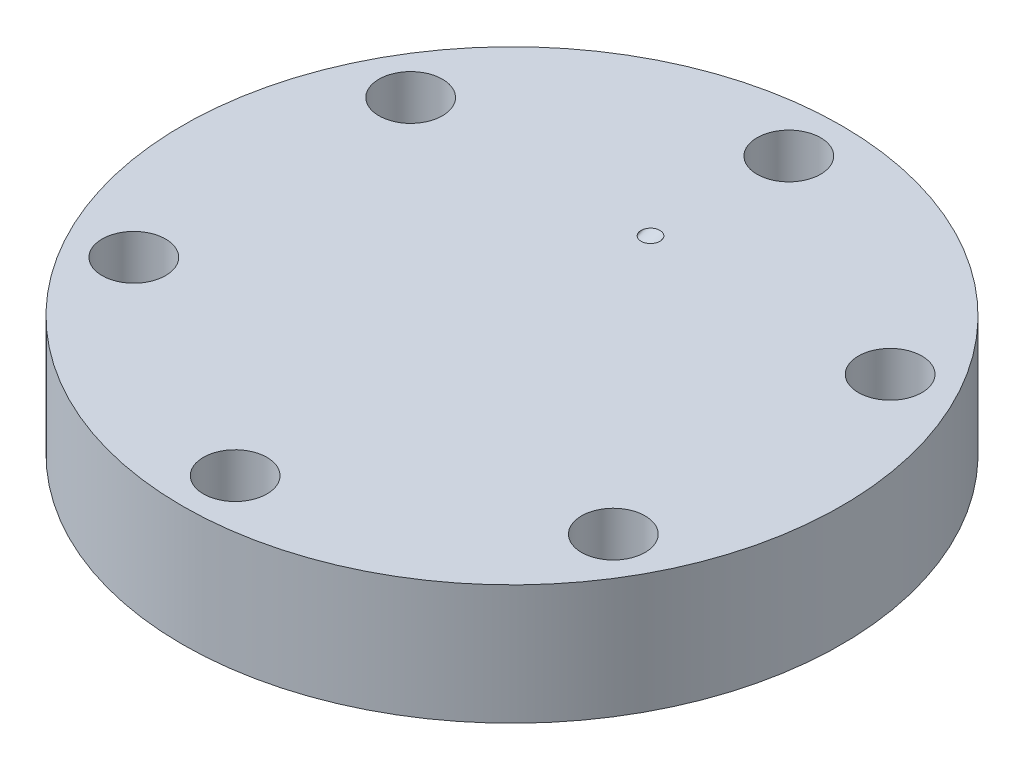
ISO-10303-21;
HEADER;
FILE_DESCRIPTION(('STEP AP214'),'2;1');
FILE_NAME('part.step','',(''),(''),'','','');
FILE_SCHEMA(('AUTOMOTIVE_DESIGN { 1 0 10303 214 1 1 1 1 }'));
ENDSEC;
DATA;
#1=APPLICATION_CONTEXT('core data for automotive mechanical design processes');
#2=APPLICATION_PROTOCOL_DEFINITION('international standard','automotive_design',2000,#1);
#3=PRODUCT_CONTEXT('',#1,'mechanical');
#4=PRODUCT('Part','Part','',(#3));
#5=PRODUCT_RELATED_PRODUCT_CATEGORY('part','',(#4));
#6=PRODUCT_DEFINITION_FORMATION('','',#4);
#7=PRODUCT_DEFINITION_CONTEXT('part definition',#1,'design');
#8=PRODUCT_DEFINITION('design','',#6,#7);
#9=PRODUCT_DEFINITION_SHAPE('','',#8);
#10=(LENGTH_UNIT() NAMED_UNIT(*) SI_UNIT(.MILLI.,.METRE.));
#11=(NAMED_UNIT(*) PLANE_ANGLE_UNIT() SI_UNIT($,.RADIAN.));
#12=(NAMED_UNIT(*) SI_UNIT($,.STERADIAN.) SOLID_ANGLE_UNIT());
#13=UNCERTAINTY_MEASURE_WITH_UNIT(LENGTH_MEASURE(1.E-05),#10,'distance_accuracy_value','');
#14=(GEOMETRIC_REPRESENTATION_CONTEXT(3) GLOBAL_UNCERTAINTY_ASSIGNED_CONTEXT((#13)) GLOBAL_UNIT_ASSIGNED_CONTEXT((#10,
#11,#12)) REPRESENTATION_CONTEXT('',''));
#15=CARTESIAN_POINT('',(0.,0.,0.));
#16=DIRECTION('',(0.,0.,1.));
#17=DIRECTION('',(1.,0.,0.));
#18=AXIS2_PLACEMENT_3D('',#15,#16,#17);
#19=CARTESIAN_POINT('',(0.,12.7,0.));
#20=DIRECTION('',(0.,1.,0.));
#21=DIRECTION('',(0.,0.,1.));
#22=AXIS2_PLACEMENT_3D('',#19,#20,#21);
#23=PLANE('',#22);
#24=CARTESIAN_POINT('',(0.,12.7,-14.6812));
#25=DIRECTION('',(0.,1.,0.));
#26=DIRECTION('',(0.,0.,1.));
#27=AXIS2_PLACEMENT_3D('',#24,#25,#26);
#28=CIRCLE('',#27,1.);
#29=CARTESIAN_POINT('',(0.0878511965507435,12.7,-13.6850663908568));
#30=VERTEX_POINT('',#29);
#31=EDGE_CURVE('E126',#30,#30,#28,.T.);
#32=ORIENTED_EDGE('',*,*,#31,.F.);
#33=EDGE_LOOP('',(#32));
#34=FACE_BOUND('',#33,.T.);
#35=CARTESIAN_POINT('',(25.4065872708242,12.7,14.6684999999998));
#36=DIRECTION('',(0.,1.,0.));
#37=DIRECTION('',(-0.866025403784443,0.,-0.499999999999992));
#38=AXIS2_PLACEMENT_3D('',#35,#36,#37);
#39=CIRCLE('',#38,3.3655);
#40=CARTESIAN_POINT('',(22.4919787743877,12.7,12.9857499999998));
#41=VERTEX_POINT('',#40);
#42=EDGE_CURVE('E146',#41,#41,#39,.T.);
#43=ORIENTED_EDGE('',*,*,#42,.F.);
#44=EDGE_LOOP('',(#43));
#45=FACE_BOUND('',#44,.T.);
#46=CARTESIAN_POINT('',(-25.406587270824,12.7,14.6685000000001));
#47=DIRECTION('',(0.,1.,0.));
#48=DIRECTION('',(0.866025403784436,0.,-0.500000000000004));
#49=AXIS2_PLACEMENT_3D('',#46,#47,#48);
#50=CIRCLE('',#49,3.3655);
#51=CARTESIAN_POINT('',(-22.4919787743875,12.7,12.9857500000001));
#52=VERTEX_POINT('',#51);
#53=EDGE_CURVE('E158',#52,#52,#50,.T.);
#54=ORIENTED_EDGE('',*,*,#53,.F.);
#55=EDGE_LOOP('',(#54));
#56=FACE_BOUND('',#55,.T.);
#57=CARTESIAN_POINT('',(0.,12.7,-29.337));
#58=DIRECTION('',(0.,1.,0.));
#59=DIRECTION('',(0.,0.,1.));
#60=AXIS2_PLACEMENT_3D('',#57,#58,#59);
#61=CIRCLE('',#60,3.3655);
#62=CARTESIAN_POINT('',(0.,12.7,-25.9715));
#63=VERTEX_POINT('',#62);
#64=EDGE_CURVE('E55',#63,#63,#61,.T.);
#65=ORIENTED_EDGE('',*,*,#64,.F.);
#66=EDGE_LOOP('',(#65));
#67=FACE_BOUND('',#66,.T.);
#68=CARTESIAN_POINT('',(0.,12.7,0.));
#69=DIRECTION('',(0.,1.,0.));
#70=DIRECTION('',(0.,0.,1.));
#71=AXIS2_PLACEMENT_3D('',#68,#69,#70);
#72=CIRCLE('',#71,34.925);
#73=CARTESIAN_POINT('',(0.,12.7,34.925));
#74=VERTEX_POINT('',#73);
#75=EDGE_CURVE('E11',#74,#74,#72,.T.);
#76=ORIENTED_EDGE('',*,*,#75,.T.);
#77=EDGE_LOOP('',(#76));
#78=FACE_BOUND('',#77,.T.);
#79=CARTESIAN_POINT('',(-25.4065872708241,12.7,-14.6684999999999));
#80=DIRECTION('',(0.,1.,0.));
#81=DIRECTION('',(0.86602540378444,0.,0.499999999999998));
#82=AXIS2_PLACEMENT_3D('',#79,#80,#81);
#83=CIRCLE('',#82,3.3655);
#84=CARTESIAN_POINT('',(-22.4919787743876,12.7,-12.9857499999999));
#85=VERTEX_POINT('',#84);
#86=EDGE_CURVE('E164',#85,#85,#83,.T.);
#87=ORIENTED_EDGE('',*,*,#86,.F.);
#88=EDGE_LOOP('',(#87));
#89=FACE_BOUND('',#88,.T.);
#90=CARTESIAN_POINT('',(2.04859176075282E-13,12.7,29.337));
#91=DIRECTION('',(0.,1.,0.));
#92=DIRECTION('',(0.,0.,-1.));
#93=AXIS2_PLACEMENT_3D('',#90,#91,#92);
#94=CIRCLE('',#93,3.3655);
#95=CARTESIAN_POINT('',(1.81358015183529E-13,12.7,25.9715));
#96=VERTEX_POINT('',#95);
#97=EDGE_CURVE('E152',#96,#96,#94,.T.);
#98=ORIENTED_EDGE('',*,*,#97,.F.);
#99=EDGE_LOOP('',(#98));
#100=FACE_BOUND('',#99,.T.);
#101=CARTESIAN_POINT('',(25.4065872708239,12.7,-14.6685000000003));
#102=DIRECTION('',(0.,1.,0.));
#103=DIRECTION('',(-0.866025403784433,0.,0.50000000000001));
#104=AXIS2_PLACEMENT_3D('',#101,#102,#103);
#105=CIRCLE('',#104,3.3655);
#106=CARTESIAN_POINT('',(22.4919787743874,12.7,-12.9857500000003));
#107=VERTEX_POINT('',#106);
#108=EDGE_CURVE('E140',#107,#107,#105,.T.);
#109=ORIENTED_EDGE('',*,*,#108,.F.);
#110=EDGE_LOOP('',(#109));
#111=FACE_BOUND('',#110,.T.);
#112=ADVANCED_FACE('F40',(#34,#45,#56,#67,#78,#89,#100,#111),#23,.T.);
#113=CARTESIAN_POINT('',(0.,0.,0.));
#114=DIRECTION('',(0.,1.,0.));
#115=DIRECTION('',(0.,0.,1.));
#116=AXIS2_PLACEMENT_3D('',#113,#114,#115);
#117=PLANE('',#116);
#118=CARTESIAN_POINT('',(0.,0.,14.6812));
#119=DIRECTION('',(0.,1.,0.));
#120=DIRECTION('',(0.,0.,1.));
#121=AXIS2_PLACEMENT_3D('',#118,#119,#120);
#122=CIRCLE('',#121,1.);
#123=CARTESIAN_POINT('',(0.,0.,15.6812));
#124=VERTEX_POINT('',#123);
#125=EDGE_CURVE('E65',#124,#124,#122,.T.);
#126=ORIENTED_EDGE('',*,*,#125,.T.);
#127=EDGE_LOOP('',(#126));
#128=FACE_BOUND('',#127,.T.);
#129=CARTESIAN_POINT('',(25.4065872708242,0.,14.6684999999998));
#130=DIRECTION('',(0.,1.,0.));
#131=DIRECTION('',(-0.866025403784443,0.,-0.499999999999992));
#132=AXIS2_PLACEMENT_3D('',#129,#130,#131);
#133=CIRCLE('',#132,3.3655);
#134=CARTESIAN_POINT('',(22.4919787743877,0.,12.9857499999998));
#135=VERTEX_POINT('',#134);
#136=EDGE_CURVE('E143',#135,#135,#133,.T.);
#137=ORIENTED_EDGE('',*,*,#136,.T.);
#138=EDGE_LOOP('',(#137));
#139=FACE_BOUND('',#138,.T.);
#140=CARTESIAN_POINT('',(-25.406587270824,0.,14.6685000000001));
#141=DIRECTION('',(0.,1.,0.));
#142=DIRECTION('',(0.866025403784436,0.,-0.500000000000004));
#143=AXIS2_PLACEMENT_3D('',#140,#141,#142);
#144=CIRCLE('',#143,3.3655);
#145=CARTESIAN_POINT('',(-22.4919787743875,0.,12.9857500000001));
#146=VERTEX_POINT('',#145);
#147=EDGE_CURVE('E155',#146,#146,#144,.T.);
#148=ORIENTED_EDGE('',*,*,#147,.T.);
#149=EDGE_LOOP('',(#148));
#150=FACE_BOUND('',#149,.T.);
#151=CARTESIAN_POINT('',(0.,0.,-29.337));
#152=DIRECTION('',(0.,1.,0.));
#153=DIRECTION('',(0.,0.,1.));
#154=AXIS2_PLACEMENT_3D('',#151,#152,#153);
#155=CIRCLE('',#154,3.3655);
#156=CARTESIAN_POINT('',(0.,0.,-25.9715));
#157=VERTEX_POINT('',#156);
#158=EDGE_CURVE('E58',#157,#157,#155,.T.);
#159=ORIENTED_EDGE('',*,*,#158,.T.);
#160=EDGE_LOOP('',(#159));
#161=FACE_BOUND('',#160,.T.);
#162=CARTESIAN_POINT('',(0.,0.,0.));
#163=DIRECTION('',(0.,1.,0.));
#164=DIRECTION('',(0.,0.,1.));
#165=AXIS2_PLACEMENT_3D('',#162,#163,#164);
#166=CIRCLE('',#165,34.925);
#167=CARTESIAN_POINT('',(0.,0.,34.925));
#168=VERTEX_POINT('',#167);
#169=EDGE_CURVE('E50',#168,#168,#166,.T.);
#170=ORIENTED_EDGE('',*,*,#169,.F.);
#171=EDGE_LOOP('',(#170));
#172=FACE_BOUND('',#171,.T.);
#173=CARTESIAN_POINT('',(-25.4065872708241,0.,-14.6684999999999));
#174=DIRECTION('',(0.,1.,0.));
#175=DIRECTION('',(0.86602540378444,0.,0.499999999999998));
#176=AXIS2_PLACEMENT_3D('',#173,#174,#175);
#177=CIRCLE('',#176,3.3655);
#178=CARTESIAN_POINT('',(-22.4919787743876,0.,-12.9857499999999));
#179=VERTEX_POINT('',#178);
#180=EDGE_CURVE('E161',#179,#179,#177,.T.);
#181=ORIENTED_EDGE('',*,*,#180,.T.);
#182=EDGE_LOOP('',(#181));
#183=FACE_BOUND('',#182,.T.);
#184=CARTESIAN_POINT('',(2.04859176075282E-13,0.,29.337));
#185=DIRECTION('',(0.,1.,0.));
#186=DIRECTION('',(0.,0.,-1.));
#187=AXIS2_PLACEMENT_3D('',#184,#185,#186);
#188=CIRCLE('',#187,3.3655);
#189=CARTESIAN_POINT('',(1.81358015183529E-13,0.,25.9715));
#190=VERTEX_POINT('',#189);
#191=EDGE_CURVE('E149',#190,#190,#188,.T.);
#192=ORIENTED_EDGE('',*,*,#191,.T.);
#193=EDGE_LOOP('',(#192));
#194=FACE_BOUND('',#193,.T.);
#195=CARTESIAN_POINT('',(25.4065872708239,0.,-14.6685000000003));
#196=DIRECTION('',(0.,1.,0.));
#197=DIRECTION('',(-0.866025403784433,0.,0.50000000000001));
#198=AXIS2_PLACEMENT_3D('',#195,#196,#197);
#199=CIRCLE('',#198,3.3655);
#200=CARTESIAN_POINT('',(22.4919787743874,0.,-12.9857500000003));
#201=VERTEX_POINT('',#200);
#202=EDGE_CURVE('E134',#201,#201,#199,.T.);
#203=ORIENTED_EDGE('',*,*,#202,.T.);
#204=EDGE_LOOP('',(#203));
#205=FACE_BOUND('',#204,.T.);
#206=ADVANCED_FACE('F69',(#128,#139,#150,#161,#172,#183,#194,#205),#117,.F.);
#207=CARTESIAN_POINT('',(0.,12.7,0.));
#208=DIRECTION('',(0.,-1.,0.));
#209=DIRECTION('',(0.,0.,-1.));
#210=AXIS2_PLACEMENT_3D('',#207,#208,#209);
#211=CYLINDRICAL_SURFACE('',#210,34.925);
#212=ORIENTED_EDGE('',*,*,#75,.F.);
#213=EDGE_LOOP('',(#212));
#214=FACE_BOUND('',#213,.T.);
#215=ORIENTED_EDGE('',*,*,#169,.T.);
#216=EDGE_LOOP('',(#215));
#217=FACE_BOUND('',#216,.T.);
#218=ADVANCED_FACE('F42',(#214,#217),#211,.T.);
#219=CARTESIAN_POINT('',(0.,12.7,-29.337));
#220=DIRECTION('',(0.,-1.,0.));
#221=DIRECTION('',(0.,0.,-1.));
#222=AXIS2_PLACEMENT_3D('',#219,#220,#221);
#223=CYLINDRICAL_SURFACE('',#222,3.3655);
#224=ORIENTED_EDGE('',*,*,#64,.T.);
#225=EDGE_LOOP('',(#224));
#226=FACE_BOUND('',#225,.T.);
#227=ORIENTED_EDGE('',*,*,#158,.F.);
#228=EDGE_LOOP('',(#227));
#229=FACE_BOUND('',#228,.T.);
#230=ADVANCED_FACE('F81',(#226,#229),#223,.F.);
#231=CARTESIAN_POINT('',(-25.4065872708241,12.7,-14.6684999999999));
#232=DIRECTION('',(0.,-1.,0.));
#233=DIRECTION('',(0.,0.,-1.));
#234=AXIS2_PLACEMENT_3D('',#231,#232,#233);
#235=CYLINDRICAL_SURFACE('',#234,3.3655);
#236=ORIENTED_EDGE('',*,*,#86,.T.);
#237=EDGE_LOOP('',(#236));
#238=FACE_BOUND('',#237,.T.);
#239=ORIENTED_EDGE('',*,*,#180,.F.);
#240=EDGE_LOOP('',(#239));
#241=FACE_BOUND('',#240,.T.);
#242=ADVANCED_FACE('F84',(#238,#241),#235,.F.);
#243=CARTESIAN_POINT('',(-25.406587270824,12.7,14.6685000000001));
#244=DIRECTION('',(0.,-1.,0.));
#245=DIRECTION('',(0.,0.,-1.));
#246=AXIS2_PLACEMENT_3D('',#243,#244,#245);
#247=CYLINDRICAL_SURFACE('',#246,3.3655);
#248=ORIENTED_EDGE('',*,*,#53,.T.);
#249=EDGE_LOOP('',(#248));
#250=FACE_BOUND('',#249,.T.);
#251=ORIENTED_EDGE('',*,*,#147,.F.);
#252=EDGE_LOOP('',(#251));
#253=FACE_BOUND('',#252,.T.);
#254=ADVANCED_FACE('F88',(#250,#253),#247,.F.);
#255=CARTESIAN_POINT('',(2.04859176075282E-13,12.7,29.337));
#256=DIRECTION('',(0.,-1.,0.));
#257=DIRECTION('',(0.,0.,-1.));
#258=AXIS2_PLACEMENT_3D('',#255,#256,#257);
#259=CYLINDRICAL_SURFACE('',#258,3.3655);
#260=ORIENTED_EDGE('',*,*,#97,.T.);
#261=EDGE_LOOP('',(#260));
#262=FACE_BOUND('',#261,.T.);
#263=ORIENTED_EDGE('',*,*,#191,.F.);
#264=EDGE_LOOP('',(#263));
#265=FACE_BOUND('',#264,.T.);
#266=ADVANCED_FACE('F92',(#262,#265),#259,.F.);
#267=CARTESIAN_POINT('',(25.4065872708242,12.7,14.6684999999998));
#268=DIRECTION('',(0.,-1.,0.));
#269=DIRECTION('',(0.,0.,-1.));
#270=AXIS2_PLACEMENT_3D('',#267,#268,#269);
#271=CYLINDRICAL_SURFACE('',#270,3.3655);
#272=ORIENTED_EDGE('',*,*,#42,.T.);
#273=EDGE_LOOP('',(#272));
#274=FACE_BOUND('',#273,.T.);
#275=ORIENTED_EDGE('',*,*,#136,.F.);
#276=EDGE_LOOP('',(#275));
#277=FACE_BOUND('',#276,.T.);
#278=ADVANCED_FACE('F96',(#274,#277),#271,.F.);
#279=CARTESIAN_POINT('',(25.4065872708239,12.7,-14.6685000000003));
#280=DIRECTION('',(0.,-1.,0.));
#281=DIRECTION('',(0.,0.,-1.));
#282=AXIS2_PLACEMENT_3D('',#279,#280,#281);
#283=CYLINDRICAL_SURFACE('',#282,3.3655);
#284=ORIENTED_EDGE('',*,*,#108,.T.);
#285=EDGE_LOOP('',(#284));
#286=FACE_BOUND('',#285,.T.);
#287=ORIENTED_EDGE('',*,*,#202,.F.);
#288=EDGE_LOOP('',(#287));
#289=FACE_BOUND('',#288,.T.);
#290=ADVANCED_FACE('F100',(#286,#289),#283,.F.);
#291=CARTESIAN_POINT('',(0.0878511965507435,12.7,-13.6850663908568));
#292=CARTESIAN_POINT('',(0.,0.,15.6812));
#293=CARTESIAN_POINT('',(0.00484006245547864,12.7,-13.6777454578109));
#294=CARTESIAN_POINT('',(-0.0833333333333333,0.,15.6812));
#295=CARTESIAN_POINT('',(-0.0899523578914653,12.7,-13.6795581722554));
#296=CARTESIAN_POINT('',(-0.1776,0.,15.6710666666667));
#297=CARTESIAN_POINT('',(-0.299208165851285,12.7,-13.7210686281213));
#298=CARTESIAN_POINT('',(-0.3824,0.,15.6113333333333));
#299=CARTESIAN_POINT('',(-0.414116860879311,12.7,-13.7612625003223));
#300=CARTESIAN_POINT('',(-0.493333333333333,0.,15.5612));
#301=CARTESIAN_POINT('',(-0.640681555611307,12.7,-13.9019022891877));
#302=CARTESIAN_POINT('',(-0.706666666666667,0.,15.4012));
#303=CARTESIAN_POINT('',(-0.751907991038722,12.7,-14.0035272959519));
#304=CARTESIAN_POINT('',(-0.808535178777393,0.,15.2901965397924));
#305=CARTESIAN_POINT('',(-0.923291369519119,12.7,-14.2663036662355));
#306=CARTESIAN_POINT('',(-0.956170703575548,0.,15.0133799307959));
#307=CARTESIAN_POINT('',(-0.981491743051382,12.7,-14.4273265352587));
#308=CARTESIAN_POINT('',(-1.,0.,14.8478666666667));
#309=CARTESIAN_POINT('',(-1.01077547523496,12.7,-14.7593710716398));
#310=CARTESIAN_POINT('',(-1.,0.,14.5145333333333));
#311=CARTESIAN_POINT('',(-0.981656178300235,12.7,-14.9280948529327));
#312=CARTESIAN_POINT('',(-0.956170703575548,0.,14.3490200692042));
#313=CARTESIAN_POINT('',(-0.858910140470769,12.7,-15.2168111382301));
#314=CARTESIAN_POINT('',(-0.808535178777393,0.,14.0722034602076));
#315=CARTESIAN_POINT('',(-0.767187278644377,12.7,-15.3363346863539));
#316=CARTESIAN_POINT('',(-0.706666666666667,0.,13.9612));
#317=CARTESIAN_POINT('',(-0.568734966808619,12.7,-15.5144576524143));
#318=CARTESIAN_POINT('',(-0.493333333333333,0.,13.8012));
#319=CARTESIAN_POINT('',(-0.462634818421414,12.7,-15.5741427767567));
#320=CARTESIAN_POINT('',(-0.3824,0.,13.7510666666667));
#321=CARTESIAN_POINT('',(-0.26387430007619,12.7,-15.6516370827298));
#322=CARTESIAN_POINT('',(-0.1776,0.,13.6913333333333));
#323=CARTESIAN_POINT('',(-0.170862330646007,12.7,-15.6700126760973));
#324=CARTESIAN_POINT('',(-0.0833333333333331,0.,13.6812));
#325=CARTESIAN_POINT('',(-0.0048400624554784,12.7,-15.6846545421891));
#326=CARTESIAN_POINT('',(0.0833333333333336,0.,13.6812));
#327=CARTESIAN_POINT('',(0.0899523578914652,12.7,-15.6828418277446));
#328=CARTESIAN_POINT('',(0.1776,0.,13.6913333333333));
#329=CARTESIAN_POINT('',(0.299208165851285,12.7,-15.6413313718787));
#330=CARTESIAN_POINT('',(0.3824,0.,13.7510666666667));
#331=CARTESIAN_POINT('',(0.414116860879311,12.7,-15.6011374996777));
#332=CARTESIAN_POINT('',(0.493333333333334,0.,13.8012));
#333=CARTESIAN_POINT('',(0.640681555611308,12.7,-15.4604977108123));
#334=CARTESIAN_POINT('',(0.706666666666667,0.,13.9612));
#335=CARTESIAN_POINT('',(0.751907991038722,12.7,-15.3588727040481));
#336=CARTESIAN_POINT('',(0.808535178777394,0.,14.0722034602076));
#337=CARTESIAN_POINT('',(0.923291369519119,12.7,-15.0960963337645));
#338=CARTESIAN_POINT('',(0.956170703575548,0.,14.3490200692042));
#339=CARTESIAN_POINT('',(0.981491743051383,12.7,-14.9350734647413));
#340=CARTESIAN_POINT('',(1.,0.,14.5145333333333));
#341=CARTESIAN_POINT('',(1.01077547523496,12.7,-14.6030289283602));
#342=CARTESIAN_POINT('',(1.,0.,14.8478666666667));
#343=CARTESIAN_POINT('',(0.981656178300236,12.7,-14.4343051470673));
#344=CARTESIAN_POINT('',(0.956170703575548,0.,15.0133799307958));
#345=CARTESIAN_POINT('',(0.858910140470769,12.7,-14.1455888617699));
#346=CARTESIAN_POINT('',(0.808535178777394,0.,15.2901965397924));
#347=CARTESIAN_POINT('',(0.767187278644377,12.7,-14.0260653136461));
#348=CARTESIAN_POINT('',(0.706666666666667,0.,15.4012));
#349=CARTESIAN_POINT('',(0.568734966808619,12.7,-13.8479423475857));
#350=CARTESIAN_POINT('',(0.493333333333334,0.,15.5612));
#351=CARTESIAN_POINT('',(0.462634818421414,12.7,-13.7882572232433));
#352=CARTESIAN_POINT('',(0.3824,0.,15.6113333333333));
#353=CARTESIAN_POINT('',(0.26387430007619,12.7,-13.7107629172702));
#354=CARTESIAN_POINT('',(0.1776,0.,15.6710666666667));
#355=CARTESIAN_POINT('',(0.170862330646008,12.7,-13.6923873239027));
#356=CARTESIAN_POINT('',(0.0833333333333334,0.,15.6812));
#357=CARTESIAN_POINT('',(0.0878511965507435,12.7,-13.6850663908568));
#358=CARTESIAN_POINT('',(0.,0.,15.6812));
#359=B_SPLINE_SURFACE_WITH_KNOTS('',3,1,((#291,#292),(#293,#294),(#295,#296),(#297,#298),(#299,
#300),(#301,#302),(#303,#304),(#305,#306),(#307,#308),(#309,#310),(#311,#312),(#313,#314),(#315,
#316),(#317,#318),(#319,#320),(#321,#322),(#323,#324),(#325,#326),(#327,#328),(#329,#330),(#331,
#332),(#333,#334),(#335,#336),(#337,#338),(#339,#340),(#341,#342),(#343,#344),(#345,#346),(#347,
#348),(#349,#350),(#351,#352),(#353,#354),(#355,#356),(#357,#358)),.UNSPECIFIED.,.T.,.F.,.F.,(4,
2,2,2,2,2,2,2,2,2,2,2,2,2,2,2,4),(2,2),(0.,0.0625000000000003,0.125000000000001,
0.187500000000001,0.250000000000001,0.312500000000002,0.375000000000002,0.437500000000002,
0.500000000000002,0.562500000000002,0.625000000000002,0.687500000000001,0.750000000000001,
0.812500000000001,0.875000000000001,0.9375,1.),(0.,1.),.UNSPECIFIED.);
#360=CARTESIAN_POINT('',(0.0878511965507435,12.7,-13.6850663908568));
#361=CARTESIAN_POINT('',(0.0869360799200066,12.5677083333333,-13.3791677826187));
#362=CARTESIAN_POINT('',(0.0860209632892697,12.4354166666667,-13.0732691743806));
#363=CARTESIAN_POINT('',(0.0841907300277959,12.1708333333333,-12.4614719579045));
#364=CARTESIAN_POINT('',(0.083275613397059,12.0385416666667,-12.1555733496664));
#365=CARTESIAN_POINT('',(0.0814453801355852,11.7739583333333,-11.5437761331902));
#366=CARTESIAN_POINT('',(0.0805302635048483,11.6416666666667,-11.2378775249521));
#367=CARTESIAN_POINT('',(0.0787000302433745,11.3770833333333,-10.6260803084759));
#368=CARTESIAN_POINT('',(0.0777849136126375,11.2447916666667,-10.3201817002378));
#369=CARTESIAN_POINT('',(0.0759546803511637,10.9802083333333,-9.70838448376163));
#370=CARTESIAN_POINT('',(0.0750395637204268,10.8479166666667,-9.40248587552354));
#371=CARTESIAN_POINT('',(0.073209330458953,10.5833333333333,-8.79068865904735));
#372=CARTESIAN_POINT('',(0.0722942138282161,10.4510416666667,-8.48479005080926));
#373=CARTESIAN_POINT('',(0.0704639805667423,10.1864583333333,-7.87299283433308));
#374=CARTESIAN_POINT('',(0.0695488639360054,10.0541666666667,-7.56709422609499));
#375=CARTESIAN_POINT('',(0.0677186306745316,9.78958333333333,-6.95529700961881));
#376=CARTESIAN_POINT('',(0.0668035140437947,9.65729166666667,-6.64939840138071));
#377=CARTESIAN_POINT('',(0.0649732807823208,9.39270833333333,-6.03760118490453));
#378=CARTESIAN_POINT('',(0.0640581641515839,9.26041666666667,-5.73170257666644));
#379=CARTESIAN_POINT('',(0.0622279308901101,8.99583333333334,-5.11990536019025));
#380=CARTESIAN_POINT('',(0.0613128142593732,8.86354166666667,-4.81400675195216));
#381=CARTESIAN_POINT('',(0.0594825809978994,8.59895833333334,-4.20220953547598));
#382=CARTESIAN_POINT('',(0.0585674643671625,8.46666666666667,-3.89631092723788));
#383=CARTESIAN_POINT('',(0.0567372311056887,8.20208333333333,-3.2845137107617));
#384=CARTESIAN_POINT('',(0.0558221144749518,8.06979166666667,-2.97861510252361));
#385=CARTESIAN_POINT('',(0.053991881213478,7.80520833333333,-2.36681788604743));
#386=CARTESIAN_POINT('',(0.0530767645827411,7.67291666666667,-2.06091927780933));
#387=CARTESIAN_POINT('',(0.0512465313212672,7.40833333333333,-1.44912206133315));
#388=CARTESIAN_POINT('',(0.0503314146905303,7.27604166666667,-1.14322345309506));
#389=CARTESIAN_POINT('',(0.0485011814290565,7.01145833333333,-0.531426236618875));
#390=CARTESIAN_POINT('',(0.0475860647983196,6.87916666666667,-0.225527628380783));
#391=CARTESIAN_POINT('',(0.0457558315368458,6.61458333333333,0.386269588095401));
#392=CARTESIAN_POINT('',(0.0448407149061089,6.48229166666667,0.692168196333493));
#393=CARTESIAN_POINT('',(0.0430104816446351,6.21770833333333,1.30396541280968));
#394=CARTESIAN_POINT('',(0.0420953650138982,6.08541666666667,1.60986402104777));
#395=CARTESIAN_POINT('',(0.0402651317524244,5.82083333333333,2.22166123752395));
#396=CARTESIAN_POINT('',(0.0393500151216875,5.68854166666667,2.52755984576204));
#397=CARTESIAN_POINT('',(0.0375197818602136,5.42395833333333,3.13935706223823));
#398=CARTESIAN_POINT('',(0.0366046652294767,5.29166666666667,3.44525567047632));
#399=CARTESIAN_POINT('',(0.0347744319680029,5.02708333333333,4.0570528869525));
#400=CARTESIAN_POINT('',(0.033859315337266,4.89479166666667,4.3629514951906));
#401=CARTESIAN_POINT('',(0.0320290820757922,4.63020833333333,4.97474871166678));
#402=CARTESIAN_POINT('',(0.0311139654450553,4.49791666666667,5.28064731990487));
#403=CARTESIAN_POINT('',(0.0292837321835815,4.23333333333333,5.89244453638106));
#404=CARTESIAN_POINT('',(0.0283686155528446,4.10104166666667,6.19834314461915));
#405=CARTESIAN_POINT('',(0.0265383822913708,3.83645833333333,6.81014036109533));
#406=CARTESIAN_POINT('',(0.0256232656606339,3.70416666666667,7.11603896933342));
#407=CARTESIAN_POINT('',(0.02379303239916,3.43958333333333,7.72783618580961));
#408=CARTESIAN_POINT('',(0.0228779157684231,3.30729166666667,8.0337347940477));
#409=CARTESIAN_POINT('',(0.0210476825069493,3.04270833333333,8.64553201052388));
#410=CARTESIAN_POINT('',(0.0201325658762124,2.91041666666667,8.95143061876197));
#411=CARTESIAN_POINT('',(0.0183023326147386,2.64583333333333,9.56322783523816));
#412=CARTESIAN_POINT('',(0.0173872159840017,2.51354166666667,9.86912644347625));
#413=CARTESIAN_POINT('',(0.0155569827225279,2.24895833333333,10.4809236599524));
#414=CARTESIAN_POINT('',(0.014641866091791,2.11666666666667,10.7868222681905));
#415=CARTESIAN_POINT('',(0.0128116328303171,1.85208333333333,11.3986194846667));
#416=CARTESIAN_POINT('',(0.0118965161995802,1.71979166666667,11.7045180929048));
#417=CARTESIAN_POINT('',(0.0100662829381064,1.45520833333333,12.316315309381));
#418=CARTESIAN_POINT('',(0.00915116630736951,1.32291666666667,12.6222139176191));
#419=CARTESIAN_POINT('',(0.0073209330458957,1.05833333333333,13.2340111340953));
#420=CARTESIAN_POINT('',(0.0064058164151588,0.926041666666667,13.5399097423334));
#421=CARTESIAN_POINT('',(0.00457558315368499,0.661458333333333,14.1517069588095));
#422=CARTESIAN_POINT('',(0.00366046652294808,0.529166666666667,14.4576055670476));
#423=CARTESIAN_POINT('',(0.00183023326147426,0.264583333333333,15.0694027835238));
#424=CARTESIAN_POINT('',(0.000915116630737347,0.132291666666667,15.3753013917619));
#425=CARTESIAN_POINT('',(0.,0.,15.6812));
#426=B_SPLINE_CURVE_WITH_KNOTS('',3,(#360,#361,#362,#363,#364,#365,#366,#367,#368,#369,#370,
#371,#372,#373,#374,#375,#376,#377,#378,#379,#380,#381,#382,#383,#384,#385,#386,#387,#388,#389,
#390,#391,#392,#393,#394,#395,#396,#397,#398,#399,#400,#401,#402,#403,#404,#405,#406,#407,#408,
#409,#410,#411,#412,#413,#414,#415,#416,#417,#418,#419,#420,#421,#422,#423,#424,#425),
.UNSPECIFIED.,.F.,.F.,(4,2,2,2,2,2,2,2,2,2,2,2,2,2,2,2,2,2,2,2,2,2,2,2,2,2,2,2,2,2,2,2,4),(0.,
0.999841452065799,1.9996829041316,2.9995243561974,3.99936580826319,4.99920726032899,
5.99904871239479,6.99889016446059,7.99873161652639,8.99857306859219,9.99841452065799,
10.9982559727238,11.9980974247896,12.9979388768554,13.9977803289212,14.997621780987,
15.9974632330528,16.9973046851186,17.9971461371844,18.9969875892502,19.996829041316,
20.9966704933818,21.9965119454476,22.9963533975134,23.9961948495792,24.996036301645,
25.9958777537108,26.9957192057766,27.9955606578424,28.9954021099082,29.995243561974,
30.9950850140398,31.9949264661056),.UNSPECIFIED.);
#427=EDGE_CURVE('BSEAM104',#30,#124,#426,.T.);
#428=ORIENTED_EDGE('',*,*,#31,.T.);
#429=ORIENTED_EDGE('',*,*,#125,.F.);
#430=ORIENTED_EDGE('',*,*,#427,.T.);
#431=ORIENTED_EDGE('',*,*,#427,.F.);
#432=EDGE_LOOP('',(#428,#430,#429,#431));
#433=FACE_BOUND('',#432,.T.);
#434=ADVANCED_FACE('F104',(#433),#359,.F.);
#435=CLOSED_SHELL('',(#112,#206,#218,#230,#242,#254,#266,#278,#290,#434));
#436=MANIFOLD_SOLID_BREP('B2',#435);
#437=ADVANCED_BREP_SHAPE_REPRESENTATION('',(#18,#436),#14);
#438=SHAPE_DEFINITION_REPRESENTATION(#9,#437);
ENDSEC;
END-ISO-10303-21;
